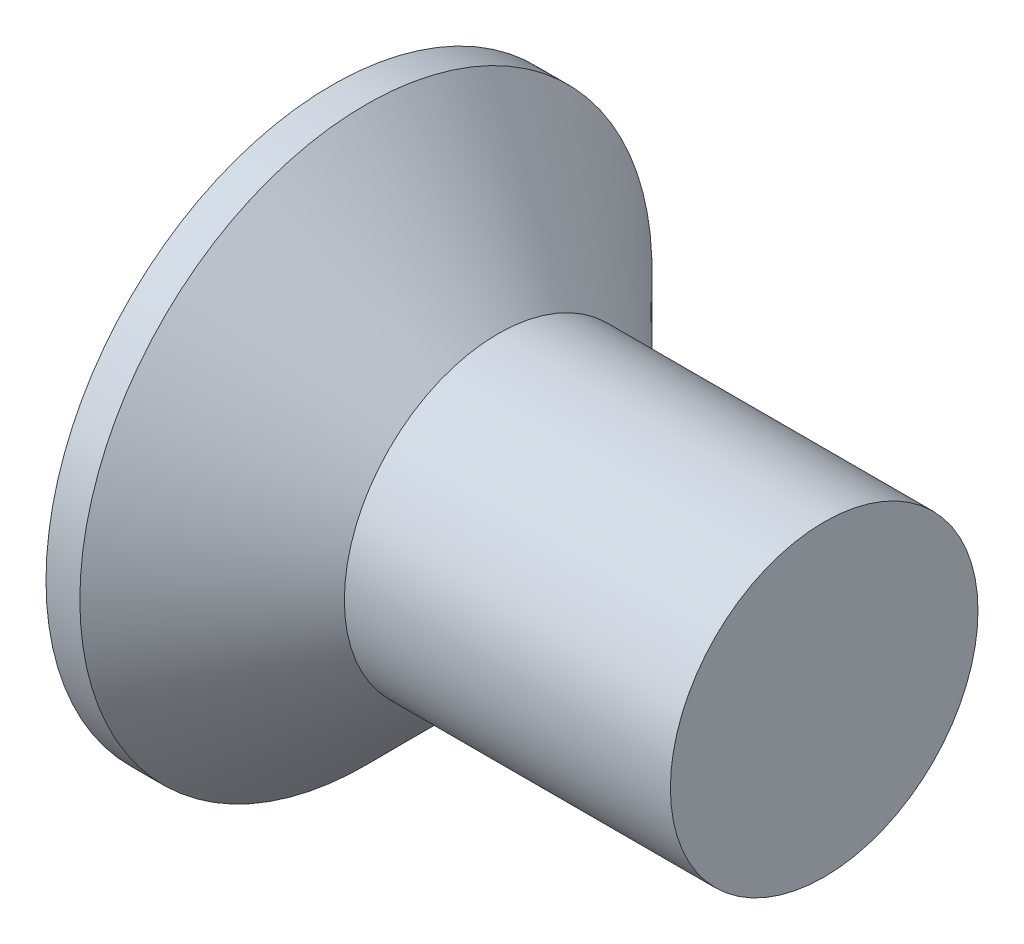
ISO-10303-21;
HEADER;
FILE_DESCRIPTION(('STEP AP214'),'2;1');
FILE_NAME('part.step','',(''),(''),'','','');
FILE_SCHEMA(('AUTOMOTIVE_DESIGN { 1 0 10303 214 1 1 1 1 }'));
ENDSEC;
DATA;
#1=APPLICATION_CONTEXT('core data for automotive mechanical design processes');
#2=APPLICATION_PROTOCOL_DEFINITION('international standard','automotive_design',2000,#1);
#3=PRODUCT_CONTEXT('',#1,'mechanical');
#4=PRODUCT('Part','Part','',(#3));
#5=PRODUCT_RELATED_PRODUCT_CATEGORY('part','',(#4));
#6=PRODUCT_DEFINITION_FORMATION('','',#4);
#7=PRODUCT_DEFINITION_CONTEXT('part definition',#1,'design');
#8=PRODUCT_DEFINITION('design','',#6,#7);
#9=PRODUCT_DEFINITION_SHAPE('','',#8);
#10=(LENGTH_UNIT() NAMED_UNIT(*) SI_UNIT(.MILLI.,.METRE.));
#11=(NAMED_UNIT(*) PLANE_ANGLE_UNIT() SI_UNIT($,.RADIAN.));
#12=(NAMED_UNIT(*) SI_UNIT($,.STERADIAN.) SOLID_ANGLE_UNIT());
#13=UNCERTAINTY_MEASURE_WITH_UNIT(LENGTH_MEASURE(1.E-05),#10,'distance_accuracy_value','');
#14=(GEOMETRIC_REPRESENTATION_CONTEXT(3) GLOBAL_UNCERTAINTY_ASSIGNED_CONTEXT((#13)) GLOBAL_UNIT_ASSIGNED_CONTEXT((#10,
#11,#12)) REPRESENTATION_CONTEXT('',''));
#15=CARTESIAN_POINT('',(0.,0.,0.));
#16=DIRECTION('',(0.,0.,1.));
#17=DIRECTION('',(1.,0.,0.));
#18=AXIS2_PLACEMENT_3D('',#15,#16,#17);
#19=CARTESIAN_POINT('',(8.,2.5,0.));
#20=DIRECTION('',(1.,0.,0.));
#21=DIRECTION('',(0.,0.,-1.));
#22=AXIS2_PLACEMENT_3D('',#19,#20,#21);
#23=PLANE('',#22);
#24=CARTESIAN_POINT('',(8.,0.,0.));
#25=DIRECTION('',(-1.,0.,0.));
#26=DIRECTION('',(0.,0.,1.));
#27=AXIS2_PLACEMENT_3D('',#24,#25,#26);
#28=CIRCLE('',#27,2.5);
#29=CARTESIAN_POINT('',(8.,0.,2.5));
#30=VERTEX_POINT('',#29);
#31=EDGE_CURVE('E20',#30,#30,#28,.T.);
#32=ORIENTED_EDGE('',*,*,#31,.F.);
#33=EDGE_LOOP('',(#32));
#34=FACE_BOUND('',#33,.T.);
#35=ADVANCED_FACE('F17',(#34),#23,.T.);
#36=CARTESIAN_POINT('',(-6.34999999999999,0.,0.));
#37=DIRECTION('',(-1.,0.,0.));
#38=DIRECTION('',(0.,0.,1.));
#39=AXIS2_PLACEMENT_3D('',#36,#37,#38);
#40=CYLINDRICAL_SURFACE('',#39,2.5);
#41=ORIENTED_EDGE('',*,*,#31,.T.);
#42=EDGE_LOOP('',(#41));
#43=FACE_BOUND('',#42,.T.);
#44=CARTESIAN_POINT('',(2.70000000000437,0.,0.));
#45=DIRECTION('',(-1.,0.,0.));
#46=DIRECTION('',(0.,0.,1.));
#47=AXIS2_PLACEMENT_3D('',#44,#45,#46);
#48=CIRCLE('',#47,2.49999999999773);
#49=CARTESIAN_POINT('',(2.70000000000437,0.,2.49999999999773));
#50=VERTEX_POINT('',#49);
#51=EDGE_CURVE('E131',#50,#50,#48,.T.);
#52=ORIENTED_EDGE('',*,*,#51,.F.);
#53=EDGE_LOOP('',(#52));
#54=FACE_BOUND('',#53,.T.);
#55=ADVANCED_FACE('F331',(#43,#54),#40,.T.);
#56=CARTESIAN_POINT('',(3.35,0.26,-0.26));
#57=DIRECTION('',(1.,0.,0.));
#58=DIRECTION('',(0.,0.,-1.));
#59=AXIS2_PLACEMENT_3D('',#56,#57,#58);
#60=PLANE('',#59);
#61=DIRECTION('',(0.,0.,1.));
#62=VECTOR('',#61,1.);
#63=CARTESIAN_POINT('',(3.35,-0.260000000000001,-0.52));
#64=LINE('',#63,#62);
#65=CARTESIAN_POINT('',(3.35,-0.260000000000001,0.259999999999999));
#66=VERTEX_POINT('',#65);
#67=CARTESIAN_POINT('',(3.35,-0.260000000000001,-0.260000000000001));
#68=VERTEX_POINT('',#67);
#69=EDGE_CURVE('E84',#66,#68,#64,.F.);
#70=ORIENTED_EDGE('',*,*,#69,.F.);
#71=DIRECTION('',(0.,1.,0.));
#72=VECTOR('',#71,1.);
#73=CARTESIAN_POINT('',(3.35,-0.520000000000009,0.259999999999998));
#74=LINE('',#73,#72);
#75=CARTESIAN_POINT('',(3.35,0.26,0.26));
#76=VERTEX_POINT('',#75);
#77=EDGE_CURVE('E124',#76,#66,#74,.F.);
#78=ORIENTED_EDGE('',*,*,#77,.F.);
#79=DIRECTION('',(0.,0.,1.));
#80=VECTOR('',#79,1.);
#81=CARTESIAN_POINT('',(3.35,0.259999999999999,0.52));
#82=LINE('',#81,#80);
#83=CARTESIAN_POINT('',(3.35,0.26,-0.260000000000001));
#84=VERTEX_POINT('',#83);
#85=EDGE_CURVE('E79',#84,#76,#82,.T.);
#86=ORIENTED_EDGE('',*,*,#85,.F.);
#87=DIRECTION('',(0.,1.,0.));
#88=VECTOR('',#87,1.);
#89=CARTESIAN_POINT('',(3.35,0.520000000000009,-0.26));
#90=LINE('',#89,#88);
#91=EDGE_CURVE('E81',#68,#84,#90,.T.);
#92=ORIENTED_EDGE('',*,*,#91,.F.);
#93=EDGE_LOOP('',(#70,#78,#86,#92));
#94=FACE_BOUND('',#93,.T.);
#95=ADVANCED_FACE('F83',(#94),#60,.F.);
#96=CARTESIAN_POINT('',(0.550000000089312,0.,0.));
#97=DIRECTION('',(-1.,0.,0.));
#98=DIRECTION('',(0.,0.,1.));
#99=AXIS2_PLACEMENT_3D('',#96,#97,#98);
#100=CONICAL_SURFACE('',#99,4.64999999996962,0.785398163397448);
#101=ORIENTED_EDGE('',*,*,#51,.T.);
#102=EDGE_LOOP('',(#101));
#103=FACE_BOUND('',#102,.T.);
#104=CARTESIAN_POINT('',(0.550000000000008,0.,0.));
#105=DIRECTION('',(-1.,0.,0.));
#106=DIRECTION('',(0.,0.,1.));
#107=AXIS2_PLACEMENT_3D('',#104,#105,#106);
#108=CIRCLE('',#107,4.65);
#109=CARTESIAN_POINT('',(0.550000000000008,0.,4.65));
#110=VERTEX_POINT('',#109);
#111=EDGE_CURVE('E99',#110,#110,#108,.T.);
#112=ORIENTED_EDGE('',*,*,#111,.F.);
#113=EDGE_LOOP('',(#112));
#114=FACE_BOUND('',#113,.T.);
#115=ADVANCED_FACE('F313',(#103,#114),#100,.T.);
#116=CARTESIAN_POINT('',(0.,0.520000000000009,-2.53));
#117=DIRECTION('',(-0.560957422052894,0.,0.827844653690396));
#118=DIRECTION('',(0.827844653690396,0.,0.560957422052894));
#119=AXIS2_PLACEMENT_3D('',#116,#117,#118);
#120=PLANE('',#119);
#121=DIRECTION('',(-0.826141195234385,-0.0641184211226667,-0.559803138263299));
#122=VECTOR('',#121,1.);
#123=CARTESIAN_POINT('',(3.35,-0.259999999999999,-0.260000000000001));
#124=LINE('',#123,#122);
#125=CARTESIAN_POINT('',(0.,-0.519999999999993,-2.53));
#126=VERTEX_POINT('',#125);
#127=EDGE_CURVE('E102',#68,#126,#124,.T.);
#128=ORIENTED_EDGE('',*,*,#127,.F.);
#129=ORIENTED_EDGE('',*,*,#91,.T.);
#130=DIRECTION('',(0.826141195234385,-0.0641184211226705,0.559803138263299));
#131=VECTOR('',#130,1.);
#132=CARTESIAN_POINT('',(0.,0.520000000000009,-2.53));
#133=LINE('',#132,#131);
#134=CARTESIAN_POINT('',(0.,0.520000000000009,-2.53));
#135=VERTEX_POINT('',#134);
#136=EDGE_CURVE('E117',#135,#84,#133,.T.);
#137=ORIENTED_EDGE('',*,*,#136,.F.);
#138=DIRECTION('',(0.,1.,0.));
#139=VECTOR('',#138,1.);
#140=CARTESIAN_POINT('',(0.,0.520000000000009,-2.53));
#141=LINE('',#140,#139);
#142=EDGE_CURVE('E91',#135,#126,#141,.F.);
#143=ORIENTED_EDGE('',*,*,#142,.T.);
#144=EDGE_LOOP('',(#128,#129,#137,#143));
#145=FACE_BOUND('',#144,.T.);
#146=ADVANCED_FACE('F103',(#145),#120,.T.);
#147=CARTESIAN_POINT('',(0.,2.53,0.52));
#148=DIRECTION('',(-0.560957422052895,-0.827844653690395,0.));
#149=DIRECTION('',(0.827844653690395,-0.560957422052895,0.));
#150=AXIS2_PLACEMENT_3D('',#147,#148,#149);
#151=PLANE('',#150);
#152=DIRECTION('',(-0.826141195234385,0.5598031382633,-0.0641184211226686));
#153=VECTOR('',#152,1.);
#154=CARTESIAN_POINT('',(3.35,0.26,-0.26));
#155=LINE('',#154,#153);
#156=CARTESIAN_POINT('',(0.,2.53,-0.52));
#157=VERTEX_POINT('',#156);
#158=EDGE_CURVE('E159',#84,#157,#155,.T.);
#159=ORIENTED_EDGE('',*,*,#158,.F.);
#160=ORIENTED_EDGE('',*,*,#85,.T.);
#161=DIRECTION('',(0.826141195234385,-0.559803138263299,-0.0641184211226685));
#162=VECTOR('',#161,1.);
#163=CARTESIAN_POINT('',(0.,2.53,0.52));
#164=LINE('',#163,#162);
#165=CARTESIAN_POINT('',(0.,2.53,0.52));
#166=VERTEX_POINT('',#165);
#167=EDGE_CURVE('E156',#166,#76,#164,.T.);
#168=ORIENTED_EDGE('',*,*,#167,.F.);
#169=DIRECTION('',(0.,0.,1.));
#170=VECTOR('',#169,1.);
#171=CARTESIAN_POINT('',(0.,2.53,0.52));
#172=LINE('',#171,#170);
#173=EDGE_CURVE('E90',#166,#157,#172,.F.);
#174=ORIENTED_EDGE('',*,*,#173,.T.);
#175=EDGE_LOOP('',(#159,#160,#168,#174));
#176=FACE_BOUND('',#175,.T.);
#177=ADVANCED_FACE('F174',(#176),#151,.T.);
#178=CARTESIAN_POINT('',(0.,-0.520000000000009,2.53));
#179=DIRECTION('',(-0.560957422052895,0.,-0.827844653690395));
#180=DIRECTION('',(-0.827844653690395,0.,0.560957422052895));
#181=AXIS2_PLACEMENT_3D('',#178,#179,#180);
#182=PLANE('',#181);
#183=DIRECTION('',(-0.826141195234385,0.0641184211226666,0.5598031382633));
#184=VECTOR('',#183,1.);
#185=CARTESIAN_POINT('',(3.35,0.259999999999999,0.26));
#186=LINE('',#185,#184);
#187=CARTESIAN_POINT('',(0.,0.519999999999992,2.53));
#188=VERTEX_POINT('',#187);
#189=EDGE_CURVE('E153',#76,#188,#186,.T.);
#190=ORIENTED_EDGE('',*,*,#189,.F.);
#191=ORIENTED_EDGE('',*,*,#77,.T.);
#192=DIRECTION('',(0.826141195234385,0.0641184211226705,-0.559803138263299));
#193=VECTOR('',#192,1.);
#194=CARTESIAN_POINT('',(0.,-0.520000000000009,2.53));
#195=LINE('',#194,#193);
#196=CARTESIAN_POINT('',(0.,-0.520000000000009,2.53));
#197=VERTEX_POINT('',#196);
#198=EDGE_CURVE('E144',#197,#66,#195,.T.);
#199=ORIENTED_EDGE('',*,*,#198,.F.);
#200=DIRECTION('',(0.,1.,0.));
#201=VECTOR('',#200,1.);
#202=CARTESIAN_POINT('',(0.,-0.520000000000009,2.53));
#203=LINE('',#202,#201);
#204=EDGE_CURVE('E126',#197,#188,#203,.T.);
#205=ORIENTED_EDGE('',*,*,#204,.T.);
#206=EDGE_LOOP('',(#190,#191,#199,#205));
#207=FACE_BOUND('',#206,.T.);
#208=ADVANCED_FACE('F195',(#207),#182,.T.);
#209=CARTESIAN_POINT('',(0.,-2.53,-0.52));
#210=DIRECTION('',(-0.560957422052894,0.827844653690396,0.));
#211=DIRECTION('',(-0.827844653690396,-0.560957422052894,0.));
#212=AXIS2_PLACEMENT_3D('',#209,#210,#211);
#213=PLANE('',#212);
#214=DIRECTION('',(-0.826141195234385,-0.559803138263299,0.0641184211226687));
#215=VECTOR('',#214,1.);
#216=CARTESIAN_POINT('',(3.35,-0.260000000000001,0.26));
#217=LINE('',#216,#215);
#218=CARTESIAN_POINT('',(0.,-2.53,0.52));
#219=VERTEX_POINT('',#218);
#220=EDGE_CURVE('E97',#66,#219,#217,.T.);
#221=ORIENTED_EDGE('',*,*,#220,.F.);
#222=ORIENTED_EDGE('',*,*,#69,.T.);
#223=DIRECTION('',(0.826141195234385,0.559803138263299,0.0641184211226686));
#224=VECTOR('',#223,1.);
#225=CARTESIAN_POINT('',(0.,-2.53,-0.52));
#226=LINE('',#225,#224);
#227=CARTESIAN_POINT('',(0.,-2.53,-0.52));
#228=VERTEX_POINT('',#227);
#229=EDGE_CURVE('E95',#228,#68,#226,.T.);
#230=ORIENTED_EDGE('',*,*,#229,.F.);
#231=DIRECTION('',(0.,0.,1.));
#232=VECTOR('',#231,1.);
#233=CARTESIAN_POINT('',(0.,-2.53,-0.52));
#234=LINE('',#233,#232);
#235=EDGE_CURVE('E35',#228,#219,#234,.T.);
#236=ORIENTED_EDGE('',*,*,#235,.T.);
#237=EDGE_LOOP('',(#221,#222,#230,#236));
#238=FACE_BOUND('',#237,.T.);
#239=ADVANCED_FACE('F93',(#238),#213,.T.);
#240=CARTESIAN_POINT('',(-6.34999999999999,0.,0.));
#241=DIRECTION('',(-1.,0.,0.));
#242=DIRECTION('',(0.,0.,1.));
#243=AXIS2_PLACEMENT_3D('',#240,#241,#242);
#244=CYLINDRICAL_SURFACE('',#243,4.65);
#245=ORIENTED_EDGE('',*,*,#111,.T.);
#246=EDGE_LOOP('',(#245));
#247=FACE_BOUND('',#246,.T.);
#248=CARTESIAN_POINT('',(0.,0.,0.));
#249=DIRECTION('',(-1.,0.,0.));
#250=DIRECTION('',(0.,0.,1.));
#251=AXIS2_PLACEMENT_3D('',#248,#249,#250);
#252=CIRCLE('',#251,4.65);
#253=CARTESIAN_POINT('',(0.,0.,4.65));
#254=VERTEX_POINT('',#253);
#255=EDGE_CURVE('E135',#254,#254,#252,.T.);
#256=ORIENTED_EDGE('',*,*,#255,.F.);
#257=EDGE_LOOP('',(#256));
#258=FACE_BOUND('',#257,.T.);
#259=ADVANCED_FACE('F271',(#247,#258),#244,.T.);
#260=CARTESIAN_POINT('',(3.73370044052863,0.,-0.230220264317181));
#261=DIRECTION('',(-0.077379238892827,0.,0.997001731888349));
#262=DIRECTION('',(0.997001731888349,0.,0.077379238892827));
#263=AXIS2_PLACEMENT_3D('',#260,#261,#262);
#264=PLANE('',#263);
#265=DIRECTION('',(0.994030271895774,0.0771486181172837,0.0771486181172836));
#266=VECTOR('',#265,1.);
#267=CARTESIAN_POINT('',(0.,-0.519999999999998,-0.52));
#268=LINE('',#267,#266);
#269=CARTESIAN_POINT('',(0.,-0.519999999999998,-0.52));
#270=VERTEX_POINT('',#269);
#271=EDGE_CURVE('E108',#270,#68,#268,.T.);
#272=ORIENTED_EDGE('',*,*,#271,.F.);
#273=DIRECTION('',(0.,1.,0.));
#274=VECTOR('',#273,1.);
#275=CARTESIAN_POINT('',(0.,0.,-0.52));
#276=LINE('',#275,#274);
#277=EDGE_CURVE('E113',#228,#270,#276,.T.);
#278=ORIENTED_EDGE('',*,*,#277,.F.);
#279=ORIENTED_EDGE('',*,*,#229,.T.);
#280=EDGE_LOOP('',(#272,#278,#279));
#281=FACE_BOUND('',#280,.T.);
#282=ADVANCED_FACE('F111',(#281),#264,.T.);
#283=CARTESIAN_POINT('',(3.73370044052864,-0.230220264317181,0.));
#284=DIRECTION('',(-0.077379238892827,0.997001731888349,0.));
#285=DIRECTION('',(-0.997001731888349,-0.077379238892827,0.));
#286=AXIS2_PLACEMENT_3D('',#283,#284,#285);
#287=PLANE('',#286);
#288=DIRECTION('',(0.,0.,1.));
#289=VECTOR('',#288,1.);
#290=CARTESIAN_POINT('',(0.,-0.519999999999998,0.));
#291=LINE('',#290,#289);
#292=EDGE_CURVE('E116',#270,#126,#291,.F.);
#293=ORIENTED_EDGE('',*,*,#292,.F.);
#294=ORIENTED_EDGE('',*,*,#271,.T.);
#295=ORIENTED_EDGE('',*,*,#127,.T.);
#296=EDGE_LOOP('',(#293,#294,#295));
#297=FACE_BOUND('',#296,.T.);
#298=ADVANCED_FACE('F115',(#297),#287,.T.);
#299=CARTESIAN_POINT('',(3.73370044052863,0.230220264317181,0.));
#300=DIRECTION('',(-0.077379238892827,-0.997001731888349,0.));
#301=DIRECTION('',(0.997001731888349,-0.077379238892827,0.));
#302=AXIS2_PLACEMENT_3D('',#299,#300,#301);
#303=PLANE('',#302);
#304=ORIENTED_EDGE('',*,*,#136,.T.);
#305=DIRECTION('',(0.994030271895774,-0.0771486181172845,0.0771486181172839));
#306=VECTOR('',#305,1.);
#307=CARTESIAN_POINT('',(0.,0.520000000000001,-0.52));
#308=LINE('',#307,#306);
#309=CARTESIAN_POINT('',(0.,0.520000000000003,-0.52));
#310=VERTEX_POINT('',#309);
#311=EDGE_CURVE('E119',#310,#84,#308,.T.);
#312=ORIENTED_EDGE('',*,*,#311,.F.);
#313=DIRECTION('',(0.,0.,1.));
#314=VECTOR('',#313,1.);
#315=CARTESIAN_POINT('',(0.,0.520000000000009,0.));
#316=LINE('',#315,#314);
#317=EDGE_CURVE('E172',#135,#310,#316,.T.);
#318=ORIENTED_EDGE('',*,*,#317,.F.);
#319=EDGE_LOOP('',(#304,#312,#318));
#320=FACE_BOUND('',#319,.T.);
#321=ADVANCED_FACE('F171',(#320),#303,.T.);
#322=CARTESIAN_POINT('',(3.73370044052863,0.,-0.230220264317181));
#323=DIRECTION('',(-0.077379238892827,0.,0.997001731888349));
#324=DIRECTION('',(0.997001731888349,0.,0.077379238892827));
#325=AXIS2_PLACEMENT_3D('',#322,#323,#324);
#326=PLANE('',#325);
#327=ORIENTED_EDGE('',*,*,#311,.T.);
#328=ORIENTED_EDGE('',*,*,#158,.T.);
#329=DIRECTION('',(0.,1.,0.));
#330=VECTOR('',#329,1.);
#331=CARTESIAN_POINT('',(0.,0.,-0.52));
#332=LINE('',#331,#330);
#333=EDGE_CURVE('E167',#310,#157,#332,.T.);
#334=ORIENTED_EDGE('',*,*,#333,.F.);
#335=EDGE_LOOP('',(#327,#328,#334));
#336=FACE_BOUND('',#335,.T.);
#337=ADVANCED_FACE('F164',(#336),#326,.T.);
#338=CARTESIAN_POINT('',(3.73370044052864,0.,0.230220264317181));
#339=DIRECTION('',(-0.077379238892827,0.,-0.997001731888349));
#340=DIRECTION('',(-0.997001731888349,0.,0.077379238892827));
#341=AXIS2_PLACEMENT_3D('',#338,#339,#340);
#342=PLANE('',#341);
#343=DIRECTION('',(0.994030271895774,-0.0771486181172836,-0.0771486181172839));
#344=VECTOR('',#343,1.);
#345=CARTESIAN_POINT('',(0.,0.519999999999998,0.52));
#346=LINE('',#345,#344);
#347=CARTESIAN_POINT('',(0.,0.519999999999998,0.52));
#348=VERTEX_POINT('',#347);
#349=EDGE_CURVE('E150',#348,#76,#346,.T.);
#350=ORIENTED_EDGE('',*,*,#349,.F.);
#351=DIRECTION('',(0.,1.,0.));
#352=VECTOR('',#351,1.);
#353=CARTESIAN_POINT('',(0.,0.,0.52));
#354=LINE('',#353,#352);
#355=EDGE_CURVE('E182',#166,#348,#354,.F.);
#356=ORIENTED_EDGE('',*,*,#355,.F.);
#357=ORIENTED_EDGE('',*,*,#167,.T.);
#358=EDGE_LOOP('',(#350,#356,#357));
#359=FACE_BOUND('',#358,.T.);
#360=ADVANCED_FACE('F199',(#359),#342,.T.);
#361=CARTESIAN_POINT('',(3.73370044052863,0.230220264317181,0.));
#362=DIRECTION('',(-0.077379238892827,-0.997001731888349,0.));
#363=DIRECTION('',(0.997001731888349,-0.077379238892827,0.));
#364=AXIS2_PLACEMENT_3D('',#361,#362,#363);
#365=PLANE('',#364);
#366=DIRECTION('',(0.,0.,1.));
#367=VECTOR('',#366,1.);
#368=CARTESIAN_POINT('',(0.,0.519999999999998,0.));
#369=LINE('',#368,#367);
#370=EDGE_CURVE('E184',#348,#188,#369,.T.);
#371=ORIENTED_EDGE('',*,*,#370,.F.);
#372=ORIENTED_EDGE('',*,*,#349,.T.);
#373=ORIENTED_EDGE('',*,*,#189,.T.);
#374=EDGE_LOOP('',(#371,#372,#373));
#375=FACE_BOUND('',#374,.T.);
#376=ADVANCED_FACE('F200',(#375),#365,.T.);
#377=CARTESIAN_POINT('',(3.73370044052864,-0.230220264317181,0.));
#378=DIRECTION('',(-0.077379238892827,0.997001731888349,0.));
#379=DIRECTION('',(-0.997001731888349,-0.077379238892827,0.));
#380=AXIS2_PLACEMENT_3D('',#377,#378,#379);
#381=PLANE('',#380);
#382=ORIENTED_EDGE('',*,*,#198,.T.);
#383=DIRECTION('',(0.994030271895774,0.0771486181172842,-0.0771486181172839));
#384=VECTOR('',#383,1.);
#385=CARTESIAN_POINT('',(0.,-0.520000000000002,0.52));
#386=LINE('',#385,#384);
#387=CARTESIAN_POINT('',(0.,-0.520000000000003,0.52));
#388=VERTEX_POINT('',#387);
#389=EDGE_CURVE('E140',#388,#66,#386,.T.);
#390=ORIENTED_EDGE('',*,*,#389,.F.);
#391=DIRECTION('',(0.,0.,1.));
#392=VECTOR('',#391,1.);
#393=CARTESIAN_POINT('',(0.,-0.520000000000009,0.));
#394=LINE('',#393,#392);
#395=EDGE_CURVE('E26',#197,#388,#394,.F.);
#396=ORIENTED_EDGE('',*,*,#395,.F.);
#397=EDGE_LOOP('',(#382,#390,#396));
#398=FACE_BOUND('',#397,.T.);
#399=ADVANCED_FACE('F192',(#398),#381,.T.);
#400=CARTESIAN_POINT('',(3.73370044052864,0.,0.230220264317181));
#401=DIRECTION('',(-0.077379238892827,0.,-0.997001731888349));
#402=DIRECTION('',(-0.997001731888349,0.,0.077379238892827));
#403=AXIS2_PLACEMENT_3D('',#400,#401,#402);
#404=PLANE('',#403);
#405=ORIENTED_EDGE('',*,*,#389,.T.);
#406=ORIENTED_EDGE('',*,*,#220,.T.);
#407=DIRECTION('',(0.,1.,0.));
#408=VECTOR('',#407,1.);
#409=CARTESIAN_POINT('',(0.,0.,0.52));
#410=LINE('',#409,#408);
#411=EDGE_CURVE('E11',#388,#219,#410,.F.);
#412=ORIENTED_EDGE('',*,*,#411,.F.);
#413=EDGE_LOOP('',(#405,#406,#412));
#414=FACE_BOUND('',#413,.T.);
#415=ADVANCED_FACE('F190',(#414),#404,.T.);
#416=CARTESIAN_POINT('',(0.,0.,0.));
#417=DIRECTION('',(-1.,0.,0.));
#418=DIRECTION('',(0.,0.,1.));
#419=AXIS2_PLACEMENT_3D('',#416,#417,#418);
#420=PLANE('',#419);
#421=ORIENTED_EDGE('',*,*,#411,.T.);
#422=ORIENTED_EDGE('',*,*,#235,.F.);
#423=ORIENTED_EDGE('',*,*,#277,.T.);
#424=ORIENTED_EDGE('',*,*,#292,.T.);
#425=ORIENTED_EDGE('',*,*,#142,.F.);
#426=ORIENTED_EDGE('',*,*,#317,.T.);
#427=ORIENTED_EDGE('',*,*,#333,.T.);
#428=ORIENTED_EDGE('',*,*,#173,.F.);
#429=ORIENTED_EDGE('',*,*,#355,.T.);
#430=ORIENTED_EDGE('',*,*,#370,.T.);
#431=ORIENTED_EDGE('',*,*,#204,.F.);
#432=ORIENTED_EDGE('',*,*,#395,.T.);
#433=EDGE_LOOP('',(#421,#422,#423,#424,#425,#426,#427,#428,#429,#430,#431,#432));
#434=FACE_BOUND('',#433,.T.);
#435=ORIENTED_EDGE('',*,*,#255,.T.);
#436=EDGE_LOOP('',(#435));
#437=FACE_BOUND('',#436,.T.);
#438=ADVANCED_FACE('F180',(#434,#437),#420,.T.);
#439=CLOSED_SHELL('',(#35,#55,#95,#115,#146,#177,#208,#239,#259,#282,#298,#321,#337,#360,#376,
#399,#415,#438));
#440=MANIFOLD_SOLID_BREP('B1',#439);
#441=ADVANCED_BREP_SHAPE_REPRESENTATION('',(#18,#440),#14);
#442=SHAPE_DEFINITION_REPRESENTATION(#9,#441);
ENDSEC;
END-ISO-10303-21;
